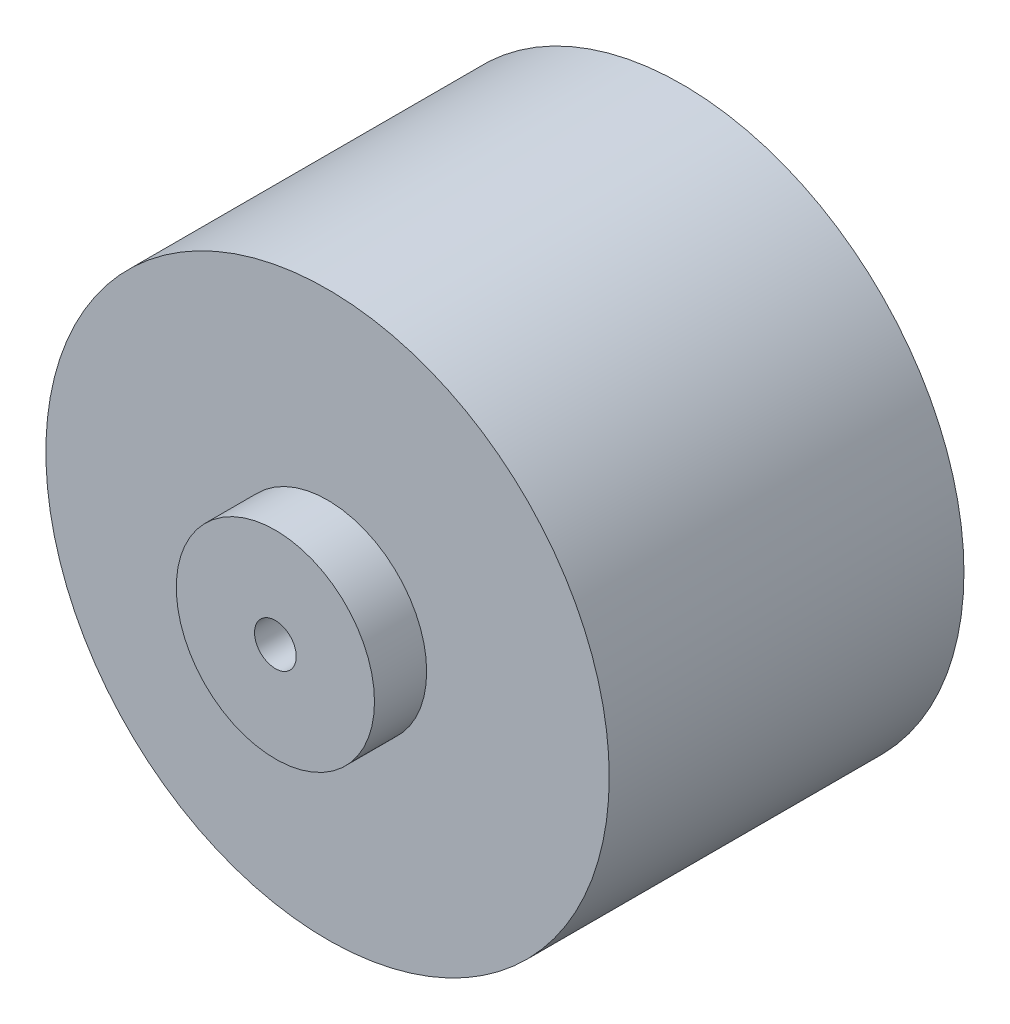
ISO-10303-21;
HEADER;
FILE_DESCRIPTION(('STEP AP214'),'2;1');
FILE_NAME('part.step','',(''),(''),'','','');
FILE_SCHEMA(('AUTOMOTIVE_DESIGN { 1 0 10303 214 1 1 1 1 }'));
ENDSEC;
DATA;
#1=APPLICATION_CONTEXT('core data for automotive mechanical design processes');
#2=APPLICATION_PROTOCOL_DEFINITION('international standard','automotive_design',2000,#1);
#3=PRODUCT_CONTEXT('',#1,'mechanical');
#4=PRODUCT('Part','Part','',(#3));
#5=PRODUCT_RELATED_PRODUCT_CATEGORY('part','',(#4));
#6=PRODUCT_DEFINITION_FORMATION('','',#4);
#7=PRODUCT_DEFINITION_CONTEXT('part definition',#1,'design');
#8=PRODUCT_DEFINITION('design','',#6,#7);
#9=PRODUCT_DEFINITION_SHAPE('','',#8);
#10=(LENGTH_UNIT() NAMED_UNIT(*) SI_UNIT(.MILLI.,.METRE.));
#11=(NAMED_UNIT(*) PLANE_ANGLE_UNIT() SI_UNIT($,.RADIAN.));
#12=(NAMED_UNIT(*) SI_UNIT($,.STERADIAN.) SOLID_ANGLE_UNIT());
#13=UNCERTAINTY_MEASURE_WITH_UNIT(LENGTH_MEASURE(1.E-05),#10,'distance_accuracy_value','');
#14=(GEOMETRIC_REPRESENTATION_CONTEXT(3) GLOBAL_UNCERTAINTY_ASSIGNED_CONTEXT((#13)) GLOBAL_UNIT_ASSIGNED_CONTEXT((#10,
#11,#12)) REPRESENTATION_CONTEXT('',''));
#15=CARTESIAN_POINT('',(0.,0.,0.));
#16=DIRECTION('',(0.,0.,1.));
#17=DIRECTION('',(1.,0.,0.));
#18=AXIS2_PLACEMENT_3D('',#15,#16,#17);
#19=CARTESIAN_POINT('',(0.,0.,34.));
#20=DIRECTION('',(0.,0.,-1.));
#21=DIRECTION('',(-1.,0.,0.));
#22=AXIS2_PLACEMENT_3D('',#19,#20,#21);
#23=CYLINDRICAL_SURFACE('',#22,27.);
#24=CARTESIAN_POINT('',(0.,0.,34.));
#25=DIRECTION('',(0.,0.,1.));
#26=DIRECTION('',(1.,0.,0.));
#27=AXIS2_PLACEMENT_3D('',#24,#25,#26);
#28=CIRCLE('',#27,27.);
#29=CARTESIAN_POINT('',(27.,0.,34.));
#30=VERTEX_POINT('',#29);
#31=EDGE_CURVE('E37',#30,#30,#28,.T.);
#32=ORIENTED_EDGE('',*,*,#31,.F.);
#33=EDGE_LOOP('',(#32));
#34=FACE_BOUND('',#33,.T.);
#35=CARTESIAN_POINT('',(0.,0.,0.));
#36=DIRECTION('',(0.,0.,1.));
#37=DIRECTION('',(1.,0.,0.));
#38=AXIS2_PLACEMENT_3D('',#35,#36,#37);
#39=CIRCLE('',#38,27.);
#40=CARTESIAN_POINT('',(27.,0.,0.));
#41=VERTEX_POINT('',#40);
#42=EDGE_CURVE('E33',#41,#41,#39,.T.);
#43=ORIENTED_EDGE('',*,*,#42,.T.);
#44=EDGE_LOOP('',(#43));
#45=FACE_BOUND('',#44,.T.);
#46=ADVANCED_FACE('F30',(#34,#45),#23,.T.);
#47=CARTESIAN_POINT('',(0.,0.,34.));
#48=DIRECTION('',(0.,0.,1.));
#49=DIRECTION('',(1.,0.,0.));
#50=AXIS2_PLACEMENT_3D('',#47,#48,#49);
#51=PLANE('',#50);
#52=CARTESIAN_POINT('',(0.,0.,34.));
#53=DIRECTION('',(0.,0.,1.));
#54=DIRECTION('',(1.,0.,0.));
#55=AXIS2_PLACEMENT_3D('',#52,#53,#54);
#56=CIRCLE('',#55,9.5);
#57=CARTESIAN_POINT('',(9.5,0.,34.));
#58=VERTEX_POINT('',#57);
#59=EDGE_CURVE('E10',#58,#58,#56,.T.);
#60=ORIENTED_EDGE('',*,*,#59,.F.);
#61=EDGE_LOOP('',(#60));
#62=FACE_BOUND('',#61,.T.);
#63=ORIENTED_EDGE('',*,*,#31,.T.);
#64=EDGE_LOOP('',(#63));
#65=FACE_BOUND('',#64,.T.);
#66=ADVANCED_FACE('F74',(#62,#65),#51,.T.);
#67=CARTESIAN_POINT('',(0.,0.,0.));
#68=DIRECTION('',(0.,0.,1.));
#69=DIRECTION('',(1.,0.,0.));
#70=AXIS2_PLACEMENT_3D('',#67,#68,#69);
#71=PLANE('',#70);
#72=ORIENTED_EDGE('',*,*,#42,.F.);
#73=EDGE_LOOP('',(#72));
#74=FACE_BOUND('',#73,.T.);
#75=ADVANCED_FACE('F69',(#74),#71,.F.);
#76=CARTESIAN_POINT('',(0.,0.,39.));
#77=DIRECTION('',(0.,0.,-1.));
#78=DIRECTION('',(-1.,0.,0.));
#79=AXIS2_PLACEMENT_3D('',#76,#77,#78);
#80=CYLINDRICAL_SURFACE('',#79,9.5);
#81=CARTESIAN_POINT('',(0.,0.,39.));
#82=DIRECTION('',(0.,0.,1.));
#83=DIRECTION('',(1.,0.,0.));
#84=AXIS2_PLACEMENT_3D('',#81,#82,#83);
#85=CIRCLE('',#84,9.5);
#86=CARTESIAN_POINT('',(9.5,0.,39.));
#87=VERTEX_POINT('',#86);
#88=EDGE_CURVE('E43',#87,#87,#85,.T.);
#89=ORIENTED_EDGE('',*,*,#88,.F.);
#90=EDGE_LOOP('',(#89));
#91=FACE_BOUND('',#90,.T.);
#92=ORIENTED_EDGE('',*,*,#59,.T.);
#93=EDGE_LOOP('',(#92));
#94=FACE_BOUND('',#93,.T.);
#95=ADVANCED_FACE('F64',(#91,#94),#80,.T.);
#96=CARTESIAN_POINT('',(0.,0.,39.));
#97=DIRECTION('',(0.,0.,1.));
#98=DIRECTION('',(1.,0.,0.));
#99=AXIS2_PLACEMENT_3D('',#96,#97,#98);
#100=PLANE('',#99);
#101=CARTESIAN_POINT('',(0.,0.,39.));
#102=DIRECTION('',(0.,0.,1.));
#103=DIRECTION('',(1.,0.,0.));
#104=AXIS2_PLACEMENT_3D('',#101,#102,#103);
#105=CIRCLE('',#104,2.);
#106=CARTESIAN_POINT('',(2.,0.,39.));
#107=VERTEX_POINT('',#106);
#108=EDGE_CURVE('E47',#107,#107,#105,.T.);
#109=ORIENTED_EDGE('',*,*,#108,.F.);
#110=EDGE_LOOP('',(#109));
#111=FACE_BOUND('',#110,.T.);
#112=ORIENTED_EDGE('',*,*,#88,.T.);
#113=EDGE_LOOP('',(#112));
#114=FACE_BOUND('',#113,.T.);
#115=ADVANCED_FACE('F58',(#111,#114),#100,.T.);
#116=CARTESIAN_POINT('',(0.,0.,9.));
#117=DIRECTION('',(0.,0.,1.));
#118=DIRECTION('',(1.,0.,0.));
#119=AXIS2_PLACEMENT_3D('',#116,#117,#118);
#120=CYLINDRICAL_SURFACE('',#119,2.);
#121=CARTESIAN_POINT('',(0.,0.,9.));
#122=DIRECTION('',(0.,0.,1.));
#123=DIRECTION('',(1.,0.,0.));
#124=AXIS2_PLACEMENT_3D('',#121,#122,#123);
#125=CIRCLE('',#124,2.);
#126=CARTESIAN_POINT('',(2.,0.,9.));
#127=VERTEX_POINT('',#126);
#128=EDGE_CURVE('E46',#127,#127,#125,.T.);
#129=ORIENTED_EDGE('',*,*,#128,.F.);
#130=EDGE_LOOP('',(#129));
#131=FACE_BOUND('',#130,.T.);
#132=ORIENTED_EDGE('',*,*,#108,.T.);
#133=EDGE_LOOP('',(#132));
#134=FACE_BOUND('',#133,.T.);
#135=ADVANCED_FACE('F55',(#131,#134),#120,.F.);
#136=CARTESIAN_POINT('',(0.,0.,9.));
#137=DIRECTION('',(0.,0.,1.));
#138=DIRECTION('',(1.,0.,0.));
#139=AXIS2_PLACEMENT_3D('',#136,#137,#138);
#140=PLANE('',#139);
#141=ORIENTED_EDGE('',*,*,#128,.T.);
#142=EDGE_LOOP('',(#141));
#143=FACE_BOUND('',#142,.T.);
#144=ADVANCED_FACE('F53',(#143),#140,.T.);
#145=CLOSED_SHELL('',(#46,#66,#75,#95,#115,#135,#144));
#146=MANIFOLD_SOLID_BREP('B2',#145);
#147=ADVANCED_BREP_SHAPE_REPRESENTATION('',(#18,#146),#14);
#148=SHAPE_DEFINITION_REPRESENTATION(#9,#147);
ENDSEC;
END-ISO-10303-21;
